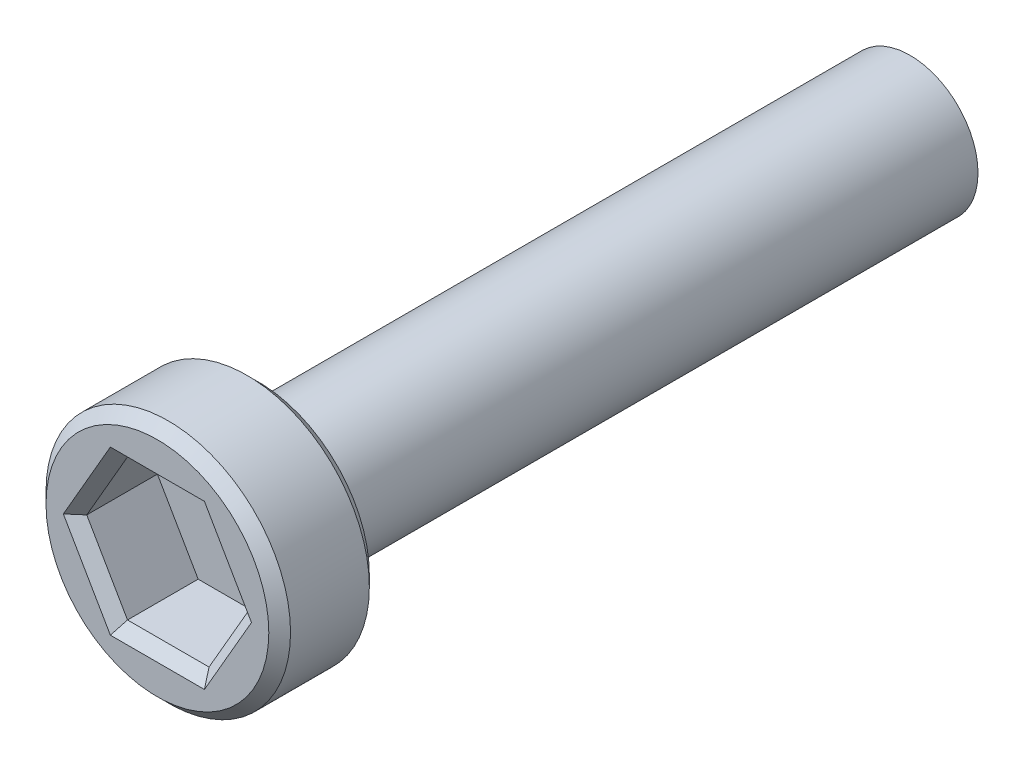
ISO-10303-21;
HEADER;
FILE_DESCRIPTION(('STEP AP214'),'2;1');
FILE_NAME('part.step','',(''),(''),'','','');
FILE_SCHEMA(('AUTOMOTIVE_DESIGN { 1 0 10303 214 1 1 1 1 }'));
ENDSEC;
DATA;
#1=APPLICATION_CONTEXT('core data for automotive mechanical design processes');
#2=APPLICATION_PROTOCOL_DEFINITION('international standard','automotive_design',2000,#1);
#3=PRODUCT_CONTEXT('',#1,'mechanical');
#4=PRODUCT('Part','Part','',(#3));
#5=PRODUCT_RELATED_PRODUCT_CATEGORY('part','',(#4));
#6=PRODUCT_DEFINITION_FORMATION('','',#4);
#7=PRODUCT_DEFINITION_CONTEXT('part definition',#1,'design');
#8=PRODUCT_DEFINITION('design','',#6,#7);
#9=PRODUCT_DEFINITION_SHAPE('','',#8);
#10=(LENGTH_UNIT() NAMED_UNIT(*) SI_UNIT(.MILLI.,.METRE.));
#11=(NAMED_UNIT(*) PLANE_ANGLE_UNIT() SI_UNIT($,.RADIAN.));
#12=(NAMED_UNIT(*) SI_UNIT($,.STERADIAN.) SOLID_ANGLE_UNIT());
#13=UNCERTAINTY_MEASURE_WITH_UNIT(LENGTH_MEASURE(1.E-05),#10,'distance_accuracy_value','');
#14=(GEOMETRIC_REPRESENTATION_CONTEXT(3) GLOBAL_UNCERTAINTY_ASSIGNED_CONTEXT((#13)) GLOBAL_UNIT_ASSIGNED_CONTEXT((#10,
#11,#12)) REPRESENTATION_CONTEXT('',''));
#15=CARTESIAN_POINT('',(0.,0.,0.));
#16=DIRECTION('',(0.,0.,1.));
#17=DIRECTION('',(1.,0.,0.));
#18=AXIS2_PLACEMENT_3D('',#15,#16,#17);
#19=CARTESIAN_POINT('',(0.,0.,12.35));
#20=DIRECTION('',(0.,0.,1.));
#21=DIRECTION('',(0.,-1.,0.));
#22=AXIS2_PLACEMENT_3D('',#19,#20,#21);
#23=PLANE('',#22);
#24=DIRECTION('',(1.,0.,0.));
#25=VECTOR('',#24,1.);
#26=CARTESIAN_POINT('',(-0.749999999999999,-1.29903810567666,12.35));
#27=LINE('',#26,#25);
#28=CARTESIAN_POINT('',(-0.749999999999998,-1.29903810567666,12.35));
#29=VERTEX_POINT('',#28);
#30=CARTESIAN_POINT('',(0.750000000000001,-1.29903810567666,12.35));
#31=VERTEX_POINT('',#30);
#32=EDGE_CURVE('E186',#29,#31,#27,.T.);
#33=ORIENTED_EDGE('',*,*,#32,.T.);
#34=DIRECTION('',(0.5,0.866025403784439,0.));
#35=VECTOR('',#34,1.);
#36=CARTESIAN_POINT('',(0.750000000000001,-1.29903810567666,12.35));
#37=LINE('',#36,#35);
#38=CARTESIAN_POINT('',(1.5,0.,12.35));
#39=VERTEX_POINT('',#38);
#40=EDGE_CURVE('E181',#31,#39,#37,.T.);
#41=ORIENTED_EDGE('',*,*,#40,.T.);
#42=DIRECTION('',(-0.5,0.866025403784438,0.));
#43=VECTOR('',#42,1.);
#44=CARTESIAN_POINT('',(1.5,0.,12.35));
#45=LINE('',#44,#43);
#46=CARTESIAN_POINT('',(0.75,1.29903810567666,12.35));
#47=VERTEX_POINT('',#46);
#48=EDGE_CURVE('E92',#39,#47,#45,.T.);
#49=ORIENTED_EDGE('',*,*,#48,.T.);
#50=DIRECTION('',(-1.,0.,0.));
#51=VECTOR('',#50,1.);
#52=CARTESIAN_POINT('',(0.75,1.29903810567666,12.35));
#53=LINE('',#52,#51);
#54=CARTESIAN_POINT('',(-0.750000000000002,1.29903810567666,12.35));
#55=VERTEX_POINT('',#54);
#56=EDGE_CURVE('E89',#47,#55,#53,.T.);
#57=ORIENTED_EDGE('',*,*,#56,.T.);
#58=DIRECTION('',(-0.499999999999999,-0.866025403784439,0.));
#59=VECTOR('',#58,1.);
#60=CARTESIAN_POINT('',(-0.750000000000002,1.29903810567666,12.35));
#61=LINE('',#60,#59);
#62=CARTESIAN_POINT('',(-1.5,0.,12.35));
#63=VERTEX_POINT('',#62);
#64=EDGE_CURVE('E86',#55,#63,#61,.T.);
#65=ORIENTED_EDGE('',*,*,#64,.T.);
#66=DIRECTION('',(0.500000000000001,-0.866025403784438,0.));
#67=VECTOR('',#66,1.);
#68=CARTESIAN_POINT('',(-1.5,0.,12.35));
#69=LINE('',#68,#67);
#70=EDGE_CURVE('E109',#63,#29,#69,.T.);
#71=ORIENTED_EDGE('',*,*,#70,.T.);
#72=EDGE_LOOP('',(#33,#41,#49,#57,#65,#71));
#73=FACE_BOUND('',#72,.T.);
#74=ADVANCED_FACE('F17',(#73),#23,.T.);
#75=CARTESIAN_POINT('',(0.75,1.29903810567666,13.85));
#76=DIRECTION('',(0.,1.,0.));
#77=DIRECTION('',(-1.,0.,0.));
#78=AXIS2_PLACEMENT_3D('',#75,#76,#77);
#79=PLANE('',#78);
#80=DIRECTION('',(0.,0.,1.));
#81=VECTOR('',#80,1.);
#82=CARTESIAN_POINT('',(-0.750000000000002,1.29903810567666,13.85));
#83=LINE('',#82,#81);
#84=CARTESIAN_POINT('',(-0.750000000000002,1.29903810567666,13.65));
#85=VERTEX_POINT('',#84);
#86=EDGE_CURVE('E95',#85,#55,#83,.F.);
#87=ORIENTED_EDGE('',*,*,#86,.T.);
#88=ORIENTED_EDGE('',*,*,#56,.F.);
#89=DIRECTION('',(0.,0.,1.));
#90=VECTOR('',#89,1.);
#91=CARTESIAN_POINT('',(0.749999999999999,1.29903810567666,13.85));
#92=LINE('',#91,#90);
#93=CARTESIAN_POINT('',(0.749999999999999,1.29903810567666,13.65));
#94=VERTEX_POINT('',#93);
#95=EDGE_CURVE('E175',#47,#94,#92,.T.);
#96=ORIENTED_EDGE('',*,*,#95,.T.);
#97=DIRECTION('',(1.,0.,0.));
#98=VECTOR('',#97,1.);
#99=CARTESIAN_POINT('',(0.374999999999999,1.29903810567666,13.65));
#100=LINE('',#99,#98);
#101=EDGE_CURVE('E100',#85,#94,#100,.T.);
#102=ORIENTED_EDGE('',*,*,#101,.F.);
#103=EDGE_LOOP('',(#87,#88,#96,#102));
#104=FACE_BOUND('',#103,.T.);
#105=ADVANCED_FACE('F98',(#104),#79,.F.);
#106=CARTESIAN_POINT('',(-0.750000000000002,1.29903810567666,13.85));
#107=DIRECTION('',(-0.866025403784439,0.499999999999999,0.));
#108=DIRECTION('',(-0.499999999999999,-0.866025403784439,0.));
#109=AXIS2_PLACEMENT_3D('',#106,#107,#108);
#110=PLANE('',#109);
#111=DIRECTION('',(0.,0.,1.));
#112=VECTOR('',#111,1.);
#113=CARTESIAN_POINT('',(-1.5,0.,13.85));
#114=LINE('',#113,#112);
#115=CARTESIAN_POINT('',(-1.5,0.,13.65));
#116=VERTEX_POINT('',#115);
#117=EDGE_CURVE('E106',#116,#63,#114,.F.);
#118=ORIENTED_EDGE('',*,*,#117,.T.);
#119=ORIENTED_EDGE('',*,*,#64,.F.);
#120=ORIENTED_EDGE('',*,*,#86,.F.);
#121=DIRECTION('',(0.499999999999999,0.86602540378444,0.));
#122=VECTOR('',#121,1.);
#123=CARTESIAN_POINT('',(-1.5,0.,13.65));
#124=LINE('',#123,#122);
#125=EDGE_CURVE('E171',#116,#85,#124,.T.);
#126=ORIENTED_EDGE('',*,*,#125,.F.);
#127=EDGE_LOOP('',(#118,#119,#120,#126));
#128=FACE_BOUND('',#127,.T.);
#129=ADVANCED_FACE('F104',(#128),#110,.F.);
#130=CARTESIAN_POINT('',(-1.5,0.,13.85));
#131=DIRECTION('',(-0.866025403784438,-0.500000000000001,0.));
#132=DIRECTION('',(0.500000000000001,-0.866025403784438,0.));
#133=AXIS2_PLACEMENT_3D('',#130,#131,#132);
#134=PLANE('',#133);
#135=DIRECTION('',(0.,0.,1.));
#136=VECTOR('',#135,1.);
#137=CARTESIAN_POINT('',(-0.749999999999999,-1.29903810567666,13.85));
#138=LINE('',#137,#136);
#139=CARTESIAN_POINT('',(-0.749999999999998,-1.29903810567666,13.65));
#140=VERTEX_POINT('',#139);
#141=EDGE_CURVE('E188',#140,#29,#138,.F.);
#142=ORIENTED_EDGE('',*,*,#141,.T.);
#143=ORIENTED_EDGE('',*,*,#70,.F.);
#144=ORIENTED_EDGE('',*,*,#117,.F.);
#145=DIRECTION('',(-0.500000000000001,0.866025403784438,0.));
#146=VECTOR('',#145,1.);
#147=CARTESIAN_POINT('',(-0.749999999999998,-1.29903810567666,13.65));
#148=LINE('',#147,#146);
#149=EDGE_CURVE('E165',#140,#116,#148,.T.);
#150=ORIENTED_EDGE('',*,*,#149,.F.);
#151=EDGE_LOOP('',(#142,#143,#144,#150));
#152=FACE_BOUND('',#151,.T.);
#153=ADVANCED_FACE('F193',(#152),#134,.F.);
#154=CARTESIAN_POINT('',(-0.749999999999999,-1.29903810567666,13.85));
#155=DIRECTION('',(0.,-1.,0.));
#156=DIRECTION('',(1.,0.,0.));
#157=AXIS2_PLACEMENT_3D('',#154,#155,#156);
#158=PLANE('',#157);
#159=DIRECTION('',(0.,0.,1.));
#160=VECTOR('',#159,1.);
#161=CARTESIAN_POINT('',(0.750000000000001,-1.29903810567666,13.85));
#162=LINE('',#161,#160);
#163=CARTESIAN_POINT('',(0.750000000000001,-1.29903810567666,13.65));
#164=VERTEX_POINT('',#163);
#165=EDGE_CURVE('E183',#164,#31,#162,.F.);
#166=ORIENTED_EDGE('',*,*,#165,.T.);
#167=ORIENTED_EDGE('',*,*,#32,.F.);
#168=ORIENTED_EDGE('',*,*,#141,.F.);
#169=DIRECTION('',(1.,0.,0.));
#170=VECTOR('',#169,1.);
#171=CARTESIAN_POINT('',(-0.374999999999999,-1.29903810567666,13.65));
#172=LINE('',#171,#170);
#173=EDGE_CURVE('E159',#164,#140,#172,.F.);
#174=ORIENTED_EDGE('',*,*,#173,.F.);
#175=EDGE_LOOP('',(#166,#167,#168,#174));
#176=FACE_BOUND('',#175,.T.);
#177=ADVANCED_FACE('F196',(#176),#158,.F.);
#178=CARTESIAN_POINT('',(0.750000000000001,-1.29903810567666,13.85));
#179=DIRECTION('',(0.866025403784439,-0.5,0.));
#180=DIRECTION('',(0.5,0.866025403784439,0.));
#181=AXIS2_PLACEMENT_3D('',#178,#179,#180);
#182=PLANE('',#181);
#183=DIRECTION('',(0.,0.,1.));
#184=VECTOR('',#183,1.);
#185=CARTESIAN_POINT('',(1.5,0.,13.85));
#186=LINE('',#185,#184);
#187=CARTESIAN_POINT('',(1.5,0.,13.65));
#188=VERTEX_POINT('',#187);
#189=EDGE_CURVE('E178',#188,#39,#186,.F.);
#190=ORIENTED_EDGE('',*,*,#189,.T.);
#191=ORIENTED_EDGE('',*,*,#40,.F.);
#192=ORIENTED_EDGE('',*,*,#165,.F.);
#193=DIRECTION('',(-0.499999999999999,-0.866025403784439,0.));
#194=VECTOR('',#193,1.);
#195=CARTESIAN_POINT('',(1.5,0.,13.65));
#196=LINE('',#195,#194);
#197=EDGE_CURVE('E153',#188,#164,#196,.T.);
#198=ORIENTED_EDGE('',*,*,#197,.F.);
#199=EDGE_LOOP('',(#190,#191,#192,#198));
#200=FACE_BOUND('',#199,.T.);
#201=ADVANCED_FACE('F201',(#200),#182,.F.);
#202=CARTESIAN_POINT('',(1.5,0.,13.85));
#203=DIRECTION('',(0.866025403784438,0.5,0.));
#204=DIRECTION('',(-0.5,0.866025403784438,0.));
#205=AXIS2_PLACEMENT_3D('',#202,#203,#204);
#206=PLANE('',#205);
#207=ORIENTED_EDGE('',*,*,#95,.F.);
#208=ORIENTED_EDGE('',*,*,#48,.F.);
#209=ORIENTED_EDGE('',*,*,#189,.F.);
#210=DIRECTION('',(0.5,-0.866025403784438,0.));
#211=VECTOR('',#210,1.);
#212=CARTESIAN_POINT('',(0.749999999999998,1.29903810567666,13.65));
#213=LINE('',#212,#211);
#214=EDGE_CURVE('E148',#94,#188,#213,.T.);
#215=ORIENTED_EDGE('',*,*,#214,.F.);
#216=EDGE_LOOP('',(#207,#208,#209,#215));
#217=FACE_BOUND('',#216,.T.);
#218=ADVANCED_FACE('F205',(#217),#206,.F.);
#219=CARTESIAN_POINT('',(0.374999999999999,1.39903810567666,13.75));
#220=DIRECTION('',(0.,-0.707106781186547,0.707106781186548));
#221=DIRECTION('',(0.,-0.707106781186548,-0.707106781186547));
#222=AXIS2_PLACEMENT_3D('',#219,#220,#221);
#223=PLANE('',#222);
#224=DIRECTION('',(-1.,0.,0.));
#225=VECTOR('',#224,1.);
#226=CARTESIAN_POINT('',(0.,1.49903810567666,13.85));
#227=LINE('',#226,#225);
#228=CARTESIAN_POINT('',(0.865470053837924,1.49903810567666,13.85));
#229=VERTEX_POINT('',#228);
#230=CARTESIAN_POINT('',(-0.865470053837927,1.49903810567666,13.85));
#231=VERTEX_POINT('',#230);
#232=EDGE_CURVE('E141',#229,#231,#227,.T.);
#233=ORIENTED_EDGE('',*,*,#232,.T.);
#234=DIRECTION('',(-0.377964473009227,0.654653670707976,0.654653670707978));
#235=VECTOR('',#234,1.);
#236=CARTESIAN_POINT('',(-0.750000000000003,1.29903810567666,13.65));
#237=LINE('',#236,#235);
#238=EDGE_CURVE('E168',#85,#231,#237,.T.);
#239=ORIENTED_EDGE('',*,*,#238,.F.);
#240=ORIENTED_EDGE('',*,*,#101,.T.);
#241=DIRECTION('',(-0.377964473009228,-0.65465367070798,-0.654653670707974));
#242=VECTOR('',#241,1.);
#243=CARTESIAN_POINT('',(0.865470053837923,1.49903810567666,13.85));
#244=LINE('',#243,#242);
#245=EDGE_CURVE('E143',#229,#94,#244,.T.);
#246=ORIENTED_EDGE('',*,*,#245,.F.);
#247=EDGE_LOOP('',(#233,#239,#240,#246));
#248=FACE_BOUND('',#247,.T.);
#249=ADVANCED_FACE('F208',(#248),#223,.T.);
#250=CARTESIAN_POINT('',(-1.02410254037845,1.02427857925749,13.75));
#251=DIRECTION('',(0.612372435695795,-0.353553390593273,0.707106781186547));
#252=DIRECTION('',(0.755928946018454,0.,-0.654653670707978));
#253=AXIS2_PLACEMENT_3D('',#250,#251,#252);
#254=PLANE('',#253);
#255=DIRECTION('',(-0.499999999999998,-0.86602540378444,0.));
#256=VECTOR('',#255,1.);
#257=CARTESIAN_POINT('',(-0.865470053837927,1.49903810567666,13.85));
#258=LINE('',#257,#256);
#259=CARTESIAN_POINT('',(-1.73094010767585,0.,13.85));
#260=VERTEX_POINT('',#259);
#261=EDGE_CURVE('E139',#231,#260,#258,.T.);
#262=ORIENTED_EDGE('',*,*,#261,.T.);
#263=DIRECTION('',(0.755928946018454,0.,-0.654653670707977));
#264=VECTOR('',#263,1.);
#265=CARTESIAN_POINT('',(-1.49183147471822,0.,13.6429258495945));
#266=LINE('',#265,#264);
#267=EDGE_CURVE('E162',#116,#260,#266,.F.);
#268=ORIENTED_EDGE('',*,*,#267,.F.);
#269=ORIENTED_EDGE('',*,*,#125,.T.);
#270=ORIENTED_EDGE('',*,*,#238,.T.);
#271=EDGE_LOOP('',(#262,#268,#269,#270));
#272=FACE_BOUND('',#271,.T.);
#273=ADVANCED_FACE('F218',(#272),#254,.T.);
#274=CARTESIAN_POINT('',(-1.39910254037844,-0.374759526419166,13.75));
#275=DIRECTION('',(0.612372435695794,0.353553390593274,0.707106781186547));
#276=DIRECTION('',(0.755928946018454,0.,-0.654653670707977));
#277=AXIS2_PLACEMENT_3D('',#274,#275,#276);
#278=PLANE('',#277);
#279=DIRECTION('',(0.5,-0.866025403784438,0.));
#280=VECTOR('',#279,1.);
#281=CARTESIAN_POINT('',(-1.73094010767585,0.,13.85));
#282=LINE('',#281,#280);
#283=CARTESIAN_POINT('',(-0.865470053837923,-1.49903810567666,13.85));
#284=VERTEX_POINT('',#283);
#285=EDGE_CURVE('E137',#260,#284,#282,.T.);
#286=ORIENTED_EDGE('',*,*,#285,.T.);
#287=DIRECTION('',(-0.377964473009228,-0.654653670707978,0.654653670707976));
#288=VECTOR('',#287,1.);
#289=CARTESIAN_POINT('',(-0.749999999999999,-1.29903810567666,13.65));
#290=LINE('',#289,#288);
#291=EDGE_CURVE('E156',#140,#284,#290,.T.);
#292=ORIENTED_EDGE('',*,*,#291,.F.);
#293=ORIENTED_EDGE('',*,*,#149,.T.);
#294=ORIENTED_EDGE('',*,*,#267,.T.);
#295=EDGE_LOOP('',(#286,#292,#293,#294));
#296=FACE_BOUND('',#295,.T.);
#297=ADVANCED_FACE('F221',(#296),#278,.T.);
#298=CARTESIAN_POINT('',(-0.374999999999999,-1.39903810567666,13.75));
#299=DIRECTION('',(0.,0.707106781186548,0.707106781186548));
#300=DIRECTION('',(0.,-0.707106781186548,0.707106781186548));
#301=AXIS2_PLACEMENT_3D('',#298,#299,#300);
#302=PLANE('',#301);
#303=DIRECTION('',(-1.,0.,0.));
#304=VECTOR('',#303,1.);
#305=CARTESIAN_POINT('',(0.,-1.49903810567666,13.85));
#306=LINE('',#305,#304);
#307=CARTESIAN_POINT('',(0.865470053837925,-1.49903810567666,13.85));
#308=VERTEX_POINT('',#307);
#309=EDGE_CURVE('E135',#284,#308,#306,.F.);
#310=ORIENTED_EDGE('',*,*,#309,.T.);
#311=DIRECTION('',(0.377964473009225,-0.654653670707979,0.654653670707976));
#312=VECTOR('',#311,1.);
#313=CARTESIAN_POINT('',(0.749999999999999,-1.29903810567666,13.65));
#314=LINE('',#313,#312);
#315=EDGE_CURVE('E151',#164,#308,#314,.T.);
#316=ORIENTED_EDGE('',*,*,#315,.F.);
#317=ORIENTED_EDGE('',*,*,#173,.T.);
#318=ORIENTED_EDGE('',*,*,#291,.T.);
#319=EDGE_LOOP('',(#310,#316,#317,#318));
#320=FACE_BOUND('',#319,.T.);
#321=ADVANCED_FACE('F224',(#320),#302,.T.);
#322=CARTESIAN_POINT('',(1.02410254037844,-1.02427857925749,13.75));
#323=DIRECTION('',(-0.612372435695795,0.353553390593274,0.707106781186547));
#324=DIRECTION('',(0.755928946018454,0.,0.654653670707978));
#325=AXIS2_PLACEMENT_3D('',#322,#323,#324);
#326=PLANE('',#325);
#327=DIRECTION('',(0.499999999999999,0.866025403784439,0.));
#328=VECTOR('',#327,1.);
#329=CARTESIAN_POINT('',(0.865470053837926,-1.49903810567666,13.85));
#330=LINE('',#329,#328);
#331=CARTESIAN_POINT('',(1.73094010767585,0.,13.85));
#332=VERTEX_POINT('',#331);
#333=EDGE_CURVE('E35',#308,#332,#330,.T.);
#334=ORIENTED_EDGE('',*,*,#333,.T.);
#335=DIRECTION('',(0.755928946018455,0.,0.654653670707977));
#336=VECTOR('',#335,1.);
#337=CARTESIAN_POINT('',(1.49183147471822,0.,13.6429258495945));
#338=LINE('',#337,#336);
#339=EDGE_CURVE('E146',#188,#332,#338,.T.);
#340=ORIENTED_EDGE('',*,*,#339,.F.);
#341=ORIENTED_EDGE('',*,*,#197,.T.);
#342=ORIENTED_EDGE('',*,*,#315,.T.);
#343=EDGE_LOOP('',(#334,#340,#341,#342));
#344=FACE_BOUND('',#343,.T.);
#345=ADVANCED_FACE('F225',(#344),#326,.T.);
#346=CARTESIAN_POINT('',(1.39910254037844,0.374759526419165,13.75));
#347=DIRECTION('',(-0.612372435695794,-0.353553390593274,0.707106781186548));
#348=DIRECTION('',(0.755928946018455,0.,0.654653670707977));
#349=AXIS2_PLACEMENT_3D('',#346,#347,#348);
#350=PLANE('',#349);
#351=DIRECTION('',(-0.5,0.866025403784439,0.));
#352=VECTOR('',#351,1.);
#353=CARTESIAN_POINT('',(1.73094010767585,0.,13.85));
#354=LINE('',#353,#352);
#355=EDGE_CURVE('E131',#332,#229,#354,.T.);
#356=ORIENTED_EDGE('',*,*,#355,.T.);
#357=ORIENTED_EDGE('',*,*,#245,.T.);
#358=ORIENTED_EDGE('',*,*,#214,.T.);
#359=ORIENTED_EDGE('',*,*,#339,.T.);
#360=EDGE_LOOP('',(#356,#357,#358,#359));
#361=FACE_BOUND('',#360,.T.);
#362=ADVANCED_FACE('F209',(#361),#350,.T.);
#363=CARTESIAN_POINT('',(0.,0.,13.85));
#364=DIRECTION('',(0.,0.,-1.));
#365=DIRECTION('',(-1.,0.,0.));
#366=AXIS2_PLACEMENT_3D('',#363,#364,#365);
#367=PLANE('',#366);
#368=ORIENTED_EDGE('',*,*,#333,.F.);
#369=ORIENTED_EDGE('',*,*,#309,.F.);
#370=ORIENTED_EDGE('',*,*,#285,.F.);
#371=ORIENTED_EDGE('',*,*,#261,.F.);
#372=ORIENTED_EDGE('',*,*,#232,.F.);
#373=ORIENTED_EDGE('',*,*,#355,.F.);
#374=EDGE_LOOP('',(#368,#369,#370,#371,#372,#373));
#375=FACE_BOUND('',#374,.T.);
#376=CARTESIAN_POINT('',(0.,0.,13.8499999999908));
#377=DIRECTION('',(0.,0.,-1.));
#378=DIRECTION('',(-1.,0.,0.));
#379=AXIS2_PLACEMENT_3D('',#376,#377,#378);
#380=CIRCLE('',#379,2.049999999997);
#381=CARTESIAN_POINT('',(-2.049999999997,0.,13.8499999999908));
#382=VERTEX_POINT('',#381);
#383=EDGE_CURVE('E20',#382,#382,#380,.T.);
#384=ORIENTED_EDGE('',*,*,#383,.F.);
#385=EDGE_LOOP('',(#384));
#386=FACE_BOUND('',#385,.T.);
#387=ADVANCED_FACE('F214',(#375,#386),#367,.F.);
#388=CARTESIAN_POINT('',(0.,0.,13.650000000041));
#389=DIRECTION('',(0.,0.,-1.));
#390=DIRECTION('',(-1.,0.,0.));
#391=AXIS2_PLACEMENT_3D('',#388,#389,#390);
#392=CONICAL_SURFACE('',#391,2.24999999994679,0.785398163397448);
#393=CARTESIAN_POINT('',(0.,0.,13.65));
#394=DIRECTION('',(0.,0.,1.));
#395=DIRECTION('',(1.,0.,0.));
#396=AXIS2_PLACEMENT_3D('',#393,#394,#395);
#397=CIRCLE('',#396,2.25);
#398=CARTESIAN_POINT('',(2.25,0.,13.65));
#399=VERTEX_POINT('',#398);
#400=EDGE_CURVE('E120',#399,#399,#397,.F.);
#401=ORIENTED_EDGE('',*,*,#400,.F.);
#402=EDGE_LOOP('',(#401));
#403=FACE_BOUND('',#402,.T.);
#404=ORIENTED_EDGE('',*,*,#383,.T.);
#405=EDGE_LOOP('',(#404));
#406=FACE_BOUND('',#405,.T.);
#407=ADVANCED_FACE('F257',(#403,#406),#392,.T.);
#408=CARTESIAN_POINT('',(0.,0.,12.));
#409=DIRECTION('',(0.,0.,1.));
#410=DIRECTION('',(1.,0.,0.));
#411=AXIS2_PLACEMENT_3D('',#408,#409,#410);
#412=CYLINDRICAL_SURFACE('',#411,2.25);
#413=CARTESIAN_POINT('',(0.,0.,12.2000000000071));
#414=DIRECTION('',(0.,0.,1.));
#415=DIRECTION('',(-1.,0.,0.));
#416=AXIS2_PLACEMENT_3D('',#413,#414,#415);
#417=CIRCLE('',#416,2.24999999994679);
#418=CARTESIAN_POINT('',(-2.24999999994679,0.,12.2000000000071));
#419=VERTEX_POINT('',#418);
#420=EDGE_CURVE('E116',#419,#419,#417,.F.);
#421=ORIENTED_EDGE('',*,*,#420,.F.);
#422=EDGE_LOOP('',(#421));
#423=FACE_BOUND('',#422,.T.);
#424=ORIENTED_EDGE('',*,*,#400,.T.);
#425=EDGE_LOOP('',(#424));
#426=FACE_BOUND('',#425,.T.);
#427=ADVANCED_FACE('F253',(#423,#426),#412,.T.);
#428=CARTESIAN_POINT('',(0.,0.,12.1999999998934));
#429=DIRECTION('',(0.,0.,1.));
#430=DIRECTION('',(1.,0.,0.));
#431=AXIS2_PLACEMENT_3D('',#428,#429,#430);
#432=CONICAL_SURFACE('',#431,2.24999999983311,0.785398163397448);
#433=CARTESIAN_POINT('',(0.,0.,12.0000000000573));
#434=DIRECTION('',(0.,0.,1.));
#435=DIRECTION('',(1.,0.,0.));
#436=AXIS2_PLACEMENT_3D('',#433,#434,#435);
#437=CIRCLE('',#436,2.049999999997);
#438=CARTESIAN_POINT('',(2.049999999997,0.,12.0000000000573));
#439=VERTEX_POINT('',#438);
#440=EDGE_CURVE('E114',#439,#439,#437,.F.);
#441=ORIENTED_EDGE('',*,*,#440,.F.);
#442=EDGE_LOOP('',(#441));
#443=FACE_BOUND('',#442,.T.);
#444=ORIENTED_EDGE('',*,*,#420,.T.);
#445=EDGE_LOOP('',(#444));
#446=FACE_BOUND('',#445,.T.);
#447=ADVANCED_FACE('F250',(#443,#446),#432,.T.);
#448=CARTESIAN_POINT('',(0.,0.,12.));
#449=DIRECTION('',(0.,0.,-1.));
#450=DIRECTION('',(-1.,0.,0.));
#451=AXIS2_PLACEMENT_3D('',#448,#449,#450);
#452=PLANE('',#451);
#453=ORIENTED_EDGE('',*,*,#440,.T.);
#454=EDGE_LOOP('',(#453));
#455=FACE_BOUND('',#454,.T.);
#456=CARTESIAN_POINT('',(0.,0.,12.));
#457=DIRECTION('',(0.,0.,1.));
#458=DIRECTION('',(1.,0.,0.));
#459=AXIS2_PLACEMENT_3D('',#456,#457,#458);
#460=CIRCLE('',#459,1.25);
#461=CARTESIAN_POINT('',(1.25,0.,12.));
#462=VERTEX_POINT('',#461);
#463=EDGE_CURVE('E26',#462,#462,#460,.F.);
#464=ORIENTED_EDGE('',*,*,#463,.F.);
#465=EDGE_LOOP('',(#464));
#466=FACE_BOUND('',#465,.T.);
#467=ADVANCED_FACE('F243',(#455,#466),#452,.T.);
#468=CARTESIAN_POINT('',(0.,0.,0.));
#469=DIRECTION('',(0.,0.,-1.));
#470=DIRECTION('',(-1.,0.,0.));
#471=AXIS2_PLACEMENT_3D('',#468,#469,#470);
#472=PLANE('',#471);
#473=CARTESIAN_POINT('',(0.,0.,0.));
#474=DIRECTION('',(0.,0.,1.));
#475=DIRECTION('',(1.,0.,0.));
#476=AXIS2_PLACEMENT_3D('',#473,#474,#475);
#477=CIRCLE('',#476,1.25);
#478=CARTESIAN_POINT('',(1.25,0.,0.));
#479=VERTEX_POINT('',#478);
#480=EDGE_CURVE('E11',#479,#479,#477,.T.);
#481=ORIENTED_EDGE('',*,*,#480,.F.);
#482=EDGE_LOOP('',(#481));
#483=FACE_BOUND('',#482,.T.);
#484=ADVANCED_FACE('F237',(#483),#472,.T.);
#485=CARTESIAN_POINT('',(0.,0.,0.));
#486=DIRECTION('',(0.,0.,1.));
#487=DIRECTION('',(1.,0.,0.));
#488=AXIS2_PLACEMENT_3D('',#485,#486,#487);
#489=CYLINDRICAL_SURFACE('',#488,1.25);
#490=ORIENTED_EDGE('',*,*,#480,.T.);
#491=EDGE_LOOP('',(#490));
#492=FACE_BOUND('',#491,.T.);
#493=ORIENTED_EDGE('',*,*,#463,.T.);
#494=EDGE_LOOP('',(#493));
#495=FACE_BOUND('',#494,.T.);
#496=ADVANCED_FACE('F235',(#492,#495),#489,.T.);
#497=CLOSED_SHELL('',(#74,#105,#129,#153,#177,#201,#218,#249,#273,#297,#321,#345,#362,#387,#407,
#427,#447,#467,#484,#496));
#498=MANIFOLD_SOLID_BREP('B1',#497);
#499=ADVANCED_BREP_SHAPE_REPRESENTATION('',(#18,#498),#14);
#500=SHAPE_DEFINITION_REPRESENTATION(#9,#499);
ENDSEC;
END-ISO-10303-21;
